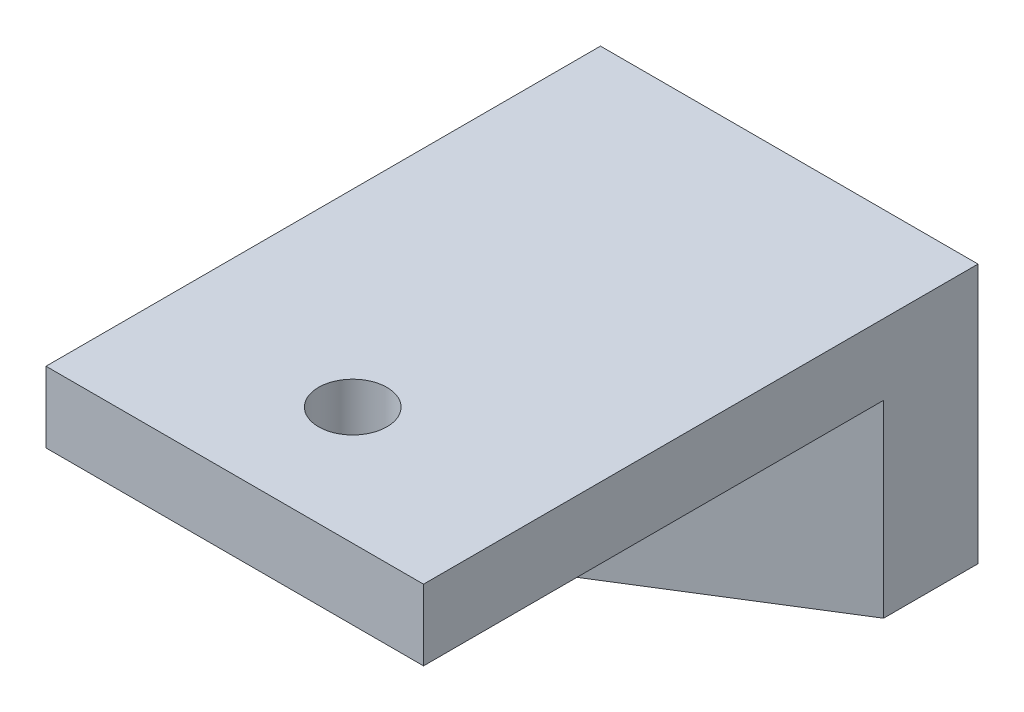
ISO-10303-21;
HEADER;
FILE_DESCRIPTION(('STEP AP214'),'2;1');
FILE_NAME('part.step','',(''),(''),'','','');
FILE_SCHEMA(('AUTOMOTIVE_DESIGN { 1 0 10303 214 1 1 1 1 }'));
ENDSEC;
DATA;
#1=APPLICATION_CONTEXT('core data for automotive mechanical design processes');
#2=APPLICATION_PROTOCOL_DEFINITION('international standard','automotive_design',2000,#1);
#3=PRODUCT_CONTEXT('',#1,'mechanical');
#4=PRODUCT('Part','Part','',(#3));
#5=PRODUCT_RELATED_PRODUCT_CATEGORY('part','',(#4));
#6=PRODUCT_DEFINITION_FORMATION('','',#4);
#7=PRODUCT_DEFINITION_CONTEXT('part definition',#1,'design');
#8=PRODUCT_DEFINITION('design','',#6,#7);
#9=PRODUCT_DEFINITION_SHAPE('','',#8);
#10=(LENGTH_UNIT() NAMED_UNIT(*) SI_UNIT(.MILLI.,.METRE.));
#11=(NAMED_UNIT(*) PLANE_ANGLE_UNIT() SI_UNIT($,.RADIAN.));
#12=(NAMED_UNIT(*) SI_UNIT($,.STERADIAN.) SOLID_ANGLE_UNIT());
#13=UNCERTAINTY_MEASURE_WITH_UNIT(LENGTH_MEASURE(1.E-05),#10,'distance_accuracy_value','');
#14=(GEOMETRIC_REPRESENTATION_CONTEXT(3) GLOBAL_UNCERTAINTY_ASSIGNED_CONTEXT((#13)) GLOBAL_UNIT_ASSIGNED_CONTEXT((#10,
#11,#12)) REPRESENTATION_CONTEXT('',''));
#15=CARTESIAN_POINT('',(0.,0.,0.));
#16=DIRECTION('',(0.,0.,1.));
#17=DIRECTION('',(1.,0.,0.));
#18=AXIS2_PLACEMENT_3D('',#15,#16,#17);
#19=CARTESIAN_POINT('',(-47.1345493764111,8.,-16.0694937756309));
#20=DIRECTION('',(-0.52999894000318,0.,0.847998304005088));
#21=DIRECTION('',(0.847998304005088,0.,0.52999894000318));
#22=AXIS2_PLACEMENT_3D('',#19,#20,#21);
#23=PLANE('',#22);
#24=DIRECTION('',(-0.847998304005088,0.,-0.52999894000318));
#25=VECTOR('',#24,1.);
#26=CARTESIAN_POINT('',(-47.1345493764111,0.,-16.0694937756309));
#27=LINE('',#26,#25);
#28=CARTESIAN_POINT('',(-39.1345493764111,0.,-11.0694937756309));
#29=VERTEX_POINT('',#28);
#30=CARTESIAN_POINT('',(-47.1345493764111,0.,-16.0694937756309));
#31=VERTEX_POINT('',#30);
#32=EDGE_CURVE('E139',#29,#31,#27,.T.);
#33=ORIENTED_EDGE('',*,*,#32,.T.);
#34=DIRECTION('',(0.,-1.,0.));
#35=VECTOR('',#34,1.);
#36=CARTESIAN_POINT('',(-47.1345493764111,8.,-16.0694937756309));
#37=LINE('',#36,#35);
#38=CARTESIAN_POINT('',(-47.1345493764111,8.,-16.0694937756309));
#39=VERTEX_POINT('',#38);
#40=EDGE_CURVE('E11',#39,#31,#37,.T.);
#41=ORIENTED_EDGE('',*,*,#40,.F.);
#42=DIRECTION('',(-0.847998304005088,0.,-0.52999894000318));
#43=VECTOR('',#42,1.);
#44=CARTESIAN_POINT('',(-47.1345493764111,8.,-16.0694937756309));
#45=LINE('',#44,#43);
#46=CARTESIAN_POINT('',(-39.1345493764111,8.,-11.0694937756309));
#47=VERTEX_POINT('',#46);
#48=EDGE_CURVE('E129',#47,#39,#45,.T.);
#49=ORIENTED_EDGE('',*,*,#48,.F.);
#50=DIRECTION('',(0.,-1.,0.));
#51=VECTOR('',#50,1.);
#52=CARTESIAN_POINT('',(-39.1345493764111,8.,-11.0694937756309));
#53=LINE('',#52,#51);
#54=EDGE_CURVE('E138',#47,#29,#53,.T.);
#55=ORIENTED_EDGE('',*,*,#54,.T.);
#56=EDGE_LOOP('',(#33,#41,#49,#55));
#57=FACE_BOUND('',#56,.T.);
#58=ADVANCED_FACE('F39',(#57),#23,.F.);
#59=CARTESIAN_POINT('',(-47.1345493764111,8.,-16.0694937756309));
#60=DIRECTION('',(1.,0.,0.));
#61=DIRECTION('',(0.,0.,-1.));
#62=AXIS2_PLACEMENT_3D('',#59,#60,#61);
#63=PLANE('',#62);
#64=DIRECTION('',(0.,0.,1.));
#65=VECTOR('',#64,1.);
#66=CARTESIAN_POINT('',(-47.1345493764111,0.,-16.0694937756309));
#67=LINE('',#66,#65);
#68=CARTESIAN_POINT('',(-47.1345493764111,0.,-12.0694937756309));
#69=VERTEX_POINT('',#68);
#70=EDGE_CURVE('E142',#31,#69,#67,.T.);
#71=ORIENTED_EDGE('',*,*,#70,.T.);
#72=DIRECTION('',(0.,-1.,0.));
#73=VECTOR('',#72,1.);
#74=CARTESIAN_POINT('',(-47.1345493764111,8.,-12.0694937756309));
#75=LINE('',#74,#73);
#76=CARTESIAN_POINT('',(-47.1345493764111,8.,-12.0694937756309));
#77=VERTEX_POINT('',#76);
#78=EDGE_CURVE('E48',#77,#69,#75,.T.);
#79=ORIENTED_EDGE('',*,*,#78,.F.);
#80=DIRECTION('',(0.,0.,1.));
#81=VECTOR('',#80,1.);
#82=CARTESIAN_POINT('',(-47.1345493764111,8.,7.43050622436912));
#83=LINE('',#82,#81);
#84=CARTESIAN_POINT('',(-47.1345493764111,8.,7.43050622436912));
#85=VERTEX_POINT('',#84);
#86=EDGE_CURVE('E127',#77,#85,#83,.T.);
#87=ORIENTED_EDGE('',*,*,#86,.T.);
#88=DIRECTION('',(0.,-1.,0.));
#89=VECTOR('',#88,1.);
#90=CARTESIAN_POINT('',(-47.1345493764111,11.,7.43050622436912));
#91=LINE('',#90,#89);
#92=CARTESIAN_POINT('',(-47.1345493764111,11.,7.43050622436912));
#93=VERTEX_POINT('',#92);
#94=EDGE_CURVE('E143',#93,#85,#91,.T.);
#95=ORIENTED_EDGE('',*,*,#94,.F.);
#96=DIRECTION('',(0.,0.,1.));
#97=VECTOR('',#96,1.);
#98=CARTESIAN_POINT('',(-47.1345493764111,11.,7.43050622436912));
#99=LINE('',#98,#97);
#100=CARTESIAN_POINT('',(-47.1345493764111,11.,-16.0694937756309));
#101=VERTEX_POINT('',#100);
#102=EDGE_CURVE('E179',#101,#93,#99,.T.);
#103=ORIENTED_EDGE('',*,*,#102,.F.);
#104=DIRECTION('',(0.,-1.,0.));
#105=VECTOR('',#104,1.);
#106=CARTESIAN_POINT('',(-47.1345493764111,11.,-16.0694937756309));
#107=LINE('',#106,#105);
#108=EDGE_CURVE('E185',#101,#39,#107,.T.);
#109=ORIENTED_EDGE('',*,*,#108,.T.);
#110=ORIENTED_EDGE('',*,*,#40,.T.);
#111=EDGE_LOOP('',(#71,#79,#87,#95,#103,#109,#110));
#112=FACE_BOUND('',#111,.T.);
#113=ADVANCED_FACE('F208',(#112),#63,.F.);
#114=CARTESIAN_POINT('',(-39.1345493764111,8.,-7.06949377563088));
#115=DIRECTION('',(0.52999894000318,0.,-0.847998304005088));
#116=DIRECTION('',(-0.847998304005088,0.,-0.52999894000318));
#117=AXIS2_PLACEMENT_3D('',#114,#115,#116);
#118=PLANE('',#117);
#119=DIRECTION('',(0.847998304005088,0.,0.52999894000318));
#120=VECTOR('',#119,1.);
#121=CARTESIAN_POINT('',(-39.1345493764111,0.,-7.06949377563088));
#122=LINE('',#121,#120);
#123=CARTESIAN_POINT('',(-39.1345493764111,0.,-7.06949377563088));
#124=VERTEX_POINT('',#123);
#125=EDGE_CURVE('E109',#69,#124,#122,.T.);
#126=ORIENTED_EDGE('',*,*,#125,.T.);
#127=DIRECTION('',(0.,-1.,0.));
#128=VECTOR('',#127,1.);
#129=CARTESIAN_POINT('',(-39.1345493764111,8.,-7.06949377563088));
#130=LINE('',#129,#128);
#131=CARTESIAN_POINT('',(-39.1345493764111,8.,-7.06949377563088));
#132=VERTEX_POINT('',#131);
#133=EDGE_CURVE('E101',#132,#124,#130,.T.);
#134=ORIENTED_EDGE('',*,*,#133,.F.);
#135=DIRECTION('',(0.847998304005088,0.,0.52999894000318));
#136=VECTOR('',#135,1.);
#137=CARTESIAN_POINT('',(-39.1345493764111,8.,-7.06949377563088));
#138=LINE('',#137,#136);
#139=EDGE_CURVE('E106',#77,#132,#138,.T.);
#140=ORIENTED_EDGE('',*,*,#139,.F.);
#141=ORIENTED_EDGE('',*,*,#78,.T.);
#142=EDGE_LOOP('',(#126,#134,#140,#141));
#143=FACE_BOUND('',#142,.T.);
#144=ADVANCED_FACE('F103',(#143),#118,.F.);
#145=CARTESIAN_POINT('',(-31.1345493764111,8.,-12.0694937756309));
#146=DIRECTION('',(-0.52999894000318,0.,-0.847998304005088));
#147=DIRECTION('',(-0.847998304005088,0.,0.52999894000318));
#148=AXIS2_PLACEMENT_3D('',#145,#146,#147);
#149=PLANE('',#148);
#150=DIRECTION('',(0.847998304005088,0.,-0.52999894000318));
#151=VECTOR('',#150,1.);
#152=CARTESIAN_POINT('',(-31.1345493764111,0.,-12.0694937756309));
#153=LINE('',#152,#151);
#154=CARTESIAN_POINT('',(-31.1345493764111,0.,-12.0694937756309));
#155=VERTEX_POINT('',#154);
#156=EDGE_CURVE('E148',#124,#155,#153,.T.);
#157=ORIENTED_EDGE('',*,*,#156,.T.);
#158=DIRECTION('',(0.,-1.,0.));
#159=VECTOR('',#158,1.);
#160=CARTESIAN_POINT('',(-31.1345493764111,8.,-12.0694937756309));
#161=LINE('',#160,#159);
#162=CARTESIAN_POINT('',(-31.1345493764111,8.,-12.0694937756309));
#163=VERTEX_POINT('',#162);
#164=EDGE_CURVE('E113',#163,#155,#161,.T.);
#165=ORIENTED_EDGE('',*,*,#164,.F.);
#166=DIRECTION('',(0.847998304005088,0.,-0.52999894000318));
#167=VECTOR('',#166,1.);
#168=CARTESIAN_POINT('',(-31.1345493764111,8.,-12.0694937756309));
#169=LINE('',#168,#167);
#170=EDGE_CURVE('E116',#132,#163,#169,.T.);
#171=ORIENTED_EDGE('',*,*,#170,.F.);
#172=ORIENTED_EDGE('',*,*,#133,.T.);
#173=EDGE_LOOP('',(#157,#165,#171,#172));
#174=FACE_BOUND('',#173,.T.);
#175=ADVANCED_FACE('F117',(#174),#149,.F.);
#176=CARTESIAN_POINT('',(-31.1345493764111,8.,-16.0694937756309));
#177=DIRECTION('',(-1.,0.,0.));
#178=DIRECTION('',(0.,0.,1.));
#179=AXIS2_PLACEMENT_3D('',#176,#177,#178);
#180=PLANE('',#179);
#181=DIRECTION('',(0.,0.,-1.));
#182=VECTOR('',#181,1.);
#183=CARTESIAN_POINT('',(-31.1345493764111,0.,-16.0694937756309));
#184=LINE('',#183,#182);
#185=CARTESIAN_POINT('',(-31.1345493764111,0.,-16.0694937756309));
#186=VERTEX_POINT('',#185);
#187=EDGE_CURVE('E78',#155,#186,#184,.T.);
#188=ORIENTED_EDGE('',*,*,#187,.T.);
#189=DIRECTION('',(0.,-1.,0.));
#190=VECTOR('',#189,1.);
#191=CARTESIAN_POINT('',(-31.1345493764111,8.,-16.0694937756309));
#192=LINE('',#191,#190);
#193=CARTESIAN_POINT('',(-31.1345493764111,8.,-16.0694937756309));
#194=VERTEX_POINT('',#193);
#195=EDGE_CURVE('E56',#194,#186,#192,.T.);
#196=ORIENTED_EDGE('',*,*,#195,.F.);
#197=DIRECTION('',(0.,-1.,0.));
#198=VECTOR('',#197,1.);
#199=CARTESIAN_POINT('',(-31.1345493764111,11.,-16.0694937756309));
#200=LINE('',#199,#198);
#201=CARTESIAN_POINT('',(-31.1345493764111,11.,-16.0694937756309));
#202=VERTEX_POINT('',#201);
#203=EDGE_CURVE('E189',#202,#194,#200,.T.);
#204=ORIENTED_EDGE('',*,*,#203,.F.);
#205=DIRECTION('',(0.,0.,-1.));
#206=VECTOR('',#205,1.);
#207=CARTESIAN_POINT('',(-31.1345493764111,11.,-16.0694937756309));
#208=LINE('',#207,#206);
#209=CARTESIAN_POINT('',(-31.1345493764111,11.,7.43050622436912));
#210=VERTEX_POINT('',#209);
#211=EDGE_CURVE('E227',#210,#202,#208,.T.);
#212=ORIENTED_EDGE('',*,*,#211,.F.);
#213=DIRECTION('',(0.,-1.,0.));
#214=VECTOR('',#213,1.);
#215=CARTESIAN_POINT('',(-31.1345493764111,11.,7.43050622436912));
#216=LINE('',#215,#214);
#217=CARTESIAN_POINT('',(-31.1345493764111,8.,7.43050622436912));
#218=VERTEX_POINT('',#217);
#219=EDGE_CURVE('E171',#210,#218,#216,.T.);
#220=ORIENTED_EDGE('',*,*,#219,.T.);
#221=DIRECTION('',(0.,0.,-1.));
#222=VECTOR('',#221,1.);
#223=CARTESIAN_POINT('',(-31.1345493764111,8.,-16.0694937756309));
#224=LINE('',#223,#222);
#225=EDGE_CURVE('E167',#218,#163,#224,.T.);
#226=ORIENTED_EDGE('',*,*,#225,.T.);
#227=ORIENTED_EDGE('',*,*,#164,.T.);
#228=EDGE_LOOP('',(#188,#196,#204,#212,#220,#226,#227));
#229=FACE_BOUND('',#228,.T.);
#230=ADVANCED_FACE('F165',(#229),#180,.F.);
#231=CARTESIAN_POINT('',(-39.1345493764111,8.,-11.0694937756309));
#232=DIRECTION('',(0.52999894000318,0.,0.847998304005088));
#233=DIRECTION('',(0.847998304005088,0.,-0.52999894000318));
#234=AXIS2_PLACEMENT_3D('',#231,#232,#233);
#235=PLANE('',#234);
#236=DIRECTION('',(-0.847998304005088,0.,0.52999894000318));
#237=VECTOR('',#236,1.);
#238=CARTESIAN_POINT('',(-39.1345493764111,0.,-11.0694937756309));
#239=LINE('',#238,#237);
#240=EDGE_CURVE('E84',#186,#29,#239,.T.);
#241=ORIENTED_EDGE('',*,*,#240,.T.);
#242=ORIENTED_EDGE('',*,*,#54,.F.);
#243=DIRECTION('',(-0.847998304005088,0.,0.52999894000318));
#244=VECTOR('',#243,1.);
#245=CARTESIAN_POINT('',(-39.1345493764111,8.,-11.0694937756309));
#246=LINE('',#245,#244);
#247=EDGE_CURVE('E122',#194,#47,#246,.T.);
#248=ORIENTED_EDGE('',*,*,#247,.F.);
#249=ORIENTED_EDGE('',*,*,#195,.T.);
#250=EDGE_LOOP('',(#241,#242,#248,#249));
#251=FACE_BOUND('',#250,.T.);
#252=ADVANCED_FACE('F223',(#251),#235,.F.);
#253=CARTESIAN_POINT('',(0.,0.,0.));
#254=DIRECTION('',(0.,1.,0.));
#255=DIRECTION('',(0.,0.,1.));
#256=AXIS2_PLACEMENT_3D('',#253,#254,#255);
#257=PLANE('',#256);
#258=ORIENTED_EDGE('',*,*,#32,.F.);
#259=ORIENTED_EDGE('',*,*,#240,.F.);
#260=ORIENTED_EDGE('',*,*,#187,.F.);
#261=ORIENTED_EDGE('',*,*,#156,.F.);
#262=ORIENTED_EDGE('',*,*,#125,.F.);
#263=ORIENTED_EDGE('',*,*,#70,.F.);
#264=EDGE_LOOP('',(#258,#259,#260,#261,#262,#263));
#265=FACE_BOUND('',#264,.T.);
#266=ADVANCED_FACE('F164',(#265),#257,.F.);
#267=CARTESIAN_POINT('',(0.,8.,0.));
#268=DIRECTION('',(0.,-1.,0.));
#269=DIRECTION('',(0.,0.,-1.));
#270=AXIS2_PLACEMENT_3D('',#267,#268,#269);
#271=PLANE('',#270);
#272=CARTESIAN_POINT('',(-39.1345493764111,8.,2.43050622436912));
#273=DIRECTION('',(0.,1.,0.));
#274=DIRECTION('',(0.,0.,1.));
#275=AXIS2_PLACEMENT_3D('',#272,#273,#274);
#276=CIRCLE('',#275,1.45);
#277=CARTESIAN_POINT('',(-39.1345493764111,8.,3.88050622436912));
#278=VERTEX_POINT('',#277);
#279=EDGE_CURVE('E236',#278,#278,#276,.T.);
#280=ORIENTED_EDGE('',*,*,#279,.T.);
#281=EDGE_LOOP('',(#280));
#282=FACE_BOUND('',#281,.T.);
#283=ORIENTED_EDGE('',*,*,#86,.F.);
#284=ORIENTED_EDGE('',*,*,#139,.T.);
#285=ORIENTED_EDGE('',*,*,#170,.T.);
#286=ORIENTED_EDGE('',*,*,#225,.F.);
#287=DIRECTION('',(1.,0.,0.));
#288=VECTOR('',#287,1.);
#289=CARTESIAN_POINT('',(-31.1345493764111,8.,7.43050622436912));
#290=LINE('',#289,#288);
#291=EDGE_CURVE('E174',#85,#218,#290,.T.);
#292=ORIENTED_EDGE('',*,*,#291,.F.);
#293=EDGE_LOOP('',(#283,#284,#285,#286,#292));
#294=FACE_BOUND('',#293,.T.);
#295=ADVANCED_FACE('F124',(#282,#294),#271,.T.);
#296=CARTESIAN_POINT('',(-31.1345493764111,11.,7.43050622436912));
#297=DIRECTION('',(0.,0.,-1.));
#298=DIRECTION('',(-1.,0.,0.));
#299=AXIS2_PLACEMENT_3D('',#296,#297,#298);
#300=PLANE('',#299);
#301=ORIENTED_EDGE('',*,*,#291,.T.);
#302=ORIENTED_EDGE('',*,*,#219,.F.);
#303=DIRECTION('',(1.,0.,0.));
#304=VECTOR('',#303,1.);
#305=CARTESIAN_POINT('',(-31.1345493764111,11.,7.43050622436912));
#306=LINE('',#305,#304);
#307=EDGE_CURVE('E204',#93,#210,#306,.T.);
#308=ORIENTED_EDGE('',*,*,#307,.F.);
#309=ORIENTED_EDGE('',*,*,#94,.T.);
#310=EDGE_LOOP('',(#301,#302,#308,#309));
#311=FACE_BOUND('',#310,.T.);
#312=ADVANCED_FACE('F201',(#311),#300,.F.);
#313=CARTESIAN_POINT('',(-47.1345493764111,11.,-16.0694937756309));
#314=DIRECTION('',(0.,0.,1.));
#315=DIRECTION('',(1.,0.,0.));
#316=AXIS2_PLACEMENT_3D('',#313,#314,#315);
#317=PLANE('',#316);
#318=DIRECTION('',(-1.,0.,0.));
#319=VECTOR('',#318,1.);
#320=CARTESIAN_POINT('',(-47.1345493764111,8.,-16.0694937756309));
#321=LINE('',#320,#319);
#322=EDGE_CURVE('E173',#194,#39,#321,.T.);
#323=ORIENTED_EDGE('',*,*,#322,.T.);
#324=ORIENTED_EDGE('',*,*,#108,.F.);
#325=DIRECTION('',(-1.,0.,0.));
#326=VECTOR('',#325,1.);
#327=CARTESIAN_POINT('',(-47.1345493764111,11.,-16.0694937756309));
#328=LINE('',#327,#326);
#329=EDGE_CURVE('E190',#202,#101,#328,.T.);
#330=ORIENTED_EDGE('',*,*,#329,.F.);
#331=ORIENTED_EDGE('',*,*,#203,.T.);
#332=EDGE_LOOP('',(#323,#324,#330,#331));
#333=FACE_BOUND('',#332,.T.);
#334=ADVANCED_FACE('F226',(#333),#317,.F.);
#335=CARTESIAN_POINT('',(0.,11.,0.));
#336=DIRECTION('',(0.,-1.,0.));
#337=DIRECTION('',(0.,0.,-1.));
#338=AXIS2_PLACEMENT_3D('',#335,#336,#337);
#339=PLANE('',#338);
#340=CARTESIAN_POINT('',(-39.1345493764111,11.,2.43050622436912));
#341=DIRECTION('',(0.,1.,0.));
#342=DIRECTION('',(0.,0.,1.));
#343=AXIS2_PLACEMENT_3D('',#340,#341,#342);
#344=CIRCLE('',#343,1.45);
#345=CARTESIAN_POINT('',(-39.1345493764111,11.,3.88050622436912));
#346=VERTEX_POINT('',#345);
#347=EDGE_CURVE('E239',#346,#346,#344,.T.);
#348=ORIENTED_EDGE('',*,*,#347,.F.);
#349=EDGE_LOOP('',(#348));
#350=FACE_BOUND('',#349,.T.);
#351=ORIENTED_EDGE('',*,*,#102,.T.);
#352=ORIENTED_EDGE('',*,*,#307,.T.);
#353=ORIENTED_EDGE('',*,*,#211,.T.);
#354=ORIENTED_EDGE('',*,*,#329,.T.);
#355=EDGE_LOOP('',(#351,#352,#353,#354));
#356=FACE_BOUND('',#355,.T.);
#357=ADVANCED_FACE('F247',(#350,#356),#339,.F.);
#358=ORIENTED_EDGE('',*,*,#247,.T.);
#359=ORIENTED_EDGE('',*,*,#48,.T.);
#360=ORIENTED_EDGE('',*,*,#322,.F.);
#361=EDGE_LOOP('',(#358,#359,#360));
#362=FACE_BOUND('',#361,.T.);
#363=ADVANCED_FACE('F224',(#362),#271,.T.);
#364=CARTESIAN_POINT('',(-39.1345493764111,8.,2.43050622436912));
#365=DIRECTION('',(0.,1.,0.));
#366=DIRECTION('',(0.,0.,1.));
#367=AXIS2_PLACEMENT_3D('',#364,#365,#366);
#368=CYLINDRICAL_SURFACE('',#367,1.45);
#369=ORIENTED_EDGE('',*,*,#279,.F.);
#370=EDGE_LOOP('',(#369));
#371=FACE_BOUND('',#370,.T.);
#372=ORIENTED_EDGE('',*,*,#347,.T.);
#373=EDGE_LOOP('',(#372));
#374=FACE_BOUND('',#373,.T.);
#375=ADVANCED_FACE('F255',(#371,#374),#368,.F.);
#376=CLOSED_SHELL('',(#58,#113,#144,#175,#230,#252,#266,#295,#312,#334,#357,#363,#375));
#377=MANIFOLD_SOLID_BREP('B2',#376);
#378=ADVANCED_BREP_SHAPE_REPRESENTATION('',(#18,#377),#14);
#379=SHAPE_DEFINITION_REPRESENTATION(#9,#378);
ENDSEC;
END-ISO-10303-21;
